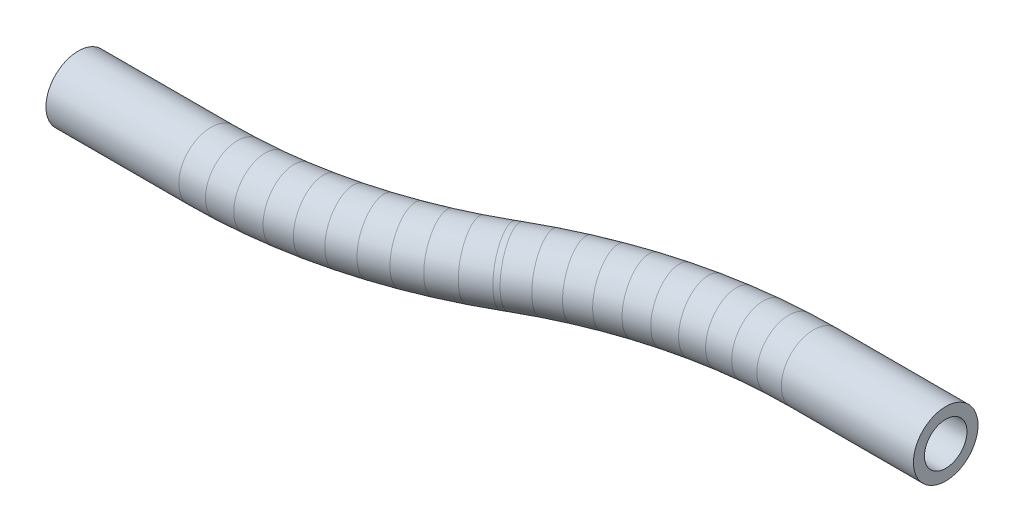
ISO-10303-21;
HEADER;
FILE_DESCRIPTION(('STEP AP214'),'2;1');
FILE_NAME('part.step','',(''),(''),'','','');
FILE_SCHEMA(('AUTOMOTIVE_DESIGN { 1 0 10303 214 1 1 1 1 }'));
ENDSEC;
DATA;
#1=APPLICATION_CONTEXT('core data for automotive mechanical design processes');
#2=APPLICATION_PROTOCOL_DEFINITION('international standard','automotive_design',2000,#1);
#3=PRODUCT_CONTEXT('',#1,'mechanical');
#4=PRODUCT('Part','Part','',(#3));
#5=PRODUCT_RELATED_PRODUCT_CATEGORY('part','',(#4));
#6=PRODUCT_DEFINITION_FORMATION('','',#4);
#7=PRODUCT_DEFINITION_CONTEXT('part definition',#1,'design');
#8=PRODUCT_DEFINITION('design','',#6,#7);
#9=PRODUCT_DEFINITION_SHAPE('','',#8);
#10=(LENGTH_UNIT() NAMED_UNIT(*) SI_UNIT(.MILLI.,.METRE.));
#11=(NAMED_UNIT(*) PLANE_ANGLE_UNIT() SI_UNIT($,.RADIAN.));
#12=(NAMED_UNIT(*) SI_UNIT($,.STERADIAN.) SOLID_ANGLE_UNIT());
#13=UNCERTAINTY_MEASURE_WITH_UNIT(LENGTH_MEASURE(1.E-05),#10,'distance_accuracy_value','');
#14=(GEOMETRIC_REPRESENTATION_CONTEXT(3) GLOBAL_UNCERTAINTY_ASSIGNED_CONTEXT((#13)) GLOBAL_UNIT_ASSIGNED_CONTEXT((#10,
#11,#12)) REPRESENTATION_CONTEXT('',''));
#15=CARTESIAN_POINT('',(0.,0.,0.));
#16=DIRECTION('',(0.,0.,1.));
#17=DIRECTION('',(1.,0.,0.));
#18=AXIS2_PLACEMENT_3D('',#15,#16,#17);
#19=CARTESIAN_POINT('',(-24.8125997034705,105.245573528022,38.3062560524749));
#20=DIRECTION('',(1.,0.,0.));
#21=DIRECTION('',(0.,0.,-1.));
#22=AXIS2_PLACEMENT_3D('',#19,#20,#21);
#23=CYLINDRICAL_SURFACE('',#22,6.);
#24=CARTESIAN_POINT('',(-24.6125997034709,105.245573528022,38.3062560524748));
#25=DIRECTION('',(0.99993495288336,0.00117156817280589,-0.0113453704288943));
#26=DIRECTION('',(-0.0114057004235759,0.102711093766131,-0.994645837077305));
#27=AXIS2_PLACEMENT_3D('',#24,#25,#26);
#28=ELLIPSE('',#27,6.00039030808825,6.);
#29=CARTESIAN_POINT('',(-24.6810383577494,105.861880179589,32.3379928116958));
#30=VERTEX_POINT('',#29);
#31=EDGE_CURVE('E45',#30,#30,#28,.F.);
#32=ORIENTED_EDGE('',*,*,#31,.F.);
#33=EDGE_LOOP('',(#32));
#34=FACE_BOUND('',#33,.T.);
#35=CARTESIAN_POINT('',(3.05311331771918E-13,105.245573528022,38.3062560524749));
#36=DIRECTION('',(1.,0.,0.));
#37=DIRECTION('',(0.,0.,-1.));
#38=AXIS2_PLACEMENT_3D('',#35,#36,#37);
#39=CIRCLE('',#38,6.);
#40=CARTESIAN_POINT('',(3.05311331771918E-13,105.245573528022,32.3062560524749));
#41=VERTEX_POINT('',#40);
#42=EDGE_CURVE('E124',#41,#41,#39,.T.);
#43=ORIENTED_EDGE('',*,*,#42,.F.);
#44=EDGE_LOOP('',(#43));
#45=FACE_BOUND('',#44,.T.);
#46=ADVANCED_FACE('F39',(#34,#45),#23,.T.);
#47=CARTESIAN_POINT('',(-29.5452626204273,105.234013370347,38.4182036745461));
#48=DIRECTION('',(0.999739819995695,0.00234298393134861,-0.0226892648905213));
#49=DIRECTION('',(-0.0226893271679736,0.,-0.999742564079706));
#50=AXIS2_PLACEMENT_3D('',#47,#48,#49);
#51=CYLINDRICAL_SURFACE('',#50,6.);
#52=CARTESIAN_POINT('',(-29.2646121022564,105.23467110113,38.4118342634042));
#53=DIRECTION('',(0.99895941537005,0.00468474866756274,-0.0453667231949676));
#54=DIRECTION('',(-0.0456079646939769,0.102610888723268,-0.993675459630505));
#55=AXIS2_PLACEMENT_3D('',#52,#53,#54);
#56=ELLIPSE('',#55,6.00156148629334,6.);
#57=CARTESIAN_POINT('',(-29.538331106632,105.850496658966,32.448229895011));
#58=VERTEX_POINT('',#57);
#59=EDGE_CURVE('E184',#58,#58,#56,.F.);
#60=ORIENTED_EDGE('',*,*,#59,.F.);
#61=EDGE_LOOP('',(#60));
#62=FACE_BOUND('',#61,.T.);
#63=ORIENTED_EDGE('',*,*,#31,.T.);
#64=EDGE_LOOP('',(#63));
#65=FACE_BOUND('',#64,.T.);
#66=ADVANCED_FACE('F192',(#62,#65),#51,.T.);
#67=CARTESIAN_POINT('',(-34.1870093127805,105.200014686749,38.7474441476682));
#68=DIRECTION('',(0.997659192214423,0.00702407564791989,-0.0680205744709416));
#69=DIRECTION('',(-0.0680222525202991,0.,-0.997683804199539));
#70=AXIS2_PLACEMENT_3D('',#67,#68,#69);
#71=CYLINDRICAL_SURFACE('',#70,6.);
#72=CARTESIAN_POINT('',(-33.9069428758409,105.201986510249,38.7283491700654));
#73=DIRECTION('',(0.995839827112946,0.00935974758020916,-0.0906390305601972));
#74=DIRECTION('',(-0.0911210114938239,0.10229045155763,-0.990572372310312));
#75=AXIS2_PLACEMENT_3D('',#72,#73,#74);
#76=ELLIPSE('',#75,6.00156148629334,6.);
#77=CARTESIAN_POINT('',(-34.4538112290143,105.815888944732,32.7833681710216));
#78=VERTEX_POINT('',#77);
#79=EDGE_CURVE('E185',#78,#78,#76,.F.);
#80=ORIENTED_EDGE('',*,*,#79,.F.);
#81=EDGE_LOOP('',(#80));
#82=FACE_BOUND('',#81,.T.);
#83=ORIENTED_EDGE('',*,*,#59,.T.);
#84=EDGE_LOOP('',(#83));
#85=FACE_BOUND('',#84,.T.);
#86=ADVANCED_FACE('F629',(#82,#85),#71,.T.);
#87=CARTESIAN_POINT('',(-38.8088300381733,105.144305965027,39.2869228555477));
#88=DIRECTION('',(0.993502266790459,0.011690549074167,-0.11321032172273));
#89=DIRECTION('',(-0.113218058682991,0.,-0.993570164199819));
#90=AXIS2_PLACEMENT_3D('',#87,#88,#89);
#91=CYLINDRICAL_SURFACE('',#90,6.);
#92=CARTESIAN_POINT('',(-38.5299305481241,105.147587777544,39.2551420513641));
#93=DIRECTION('',(0.990647727619871,0.0140152672739085,-0.135722702761279));
#94=DIRECTION('',(-0.13644442004562,0.101757130648779,-0.985407736219146));
#95=AXIS2_PLACEMENT_3D('',#92,#93,#94);
#96=ELLIPSE('',#95,6.00156148629334,6.);
#97=CARTESIAN_POINT('',(-39.3488101244895,105.758289453802,33.3411569333758));
#98=VERTEX_POINT('',#97);
#99=EDGE_CURVE('E176',#98,#98,#96,.F.);
#100=ORIENTED_EDGE('',*,*,#99,.F.);
#101=EDGE_LOOP('',(#100));
#102=FACE_BOUND('',#101,.T.);
#103=ORIENTED_EDGE('',*,*,#79,.T.);
#104=EDGE_LOOP('',(#103));
#105=FACE_BOUND('',#104,.T.);
#106=ADVANCED_FACE('F616',(#102,#105),#91,.T.);
#107=CARTESIAN_POINT('',(-43.4011060053869,105.067003144459,40.0355170516811));
#108=DIRECTION('',(0.98727769498921,0.0163326924890507,-0.158164459133051));
#109=DIRECTION('',(-0.158185559080532,0.,-0.987409402881287));
#110=AXIS2_PLACEMENT_3D('',#107,#108,#109);
#111=CYLINDRICAL_SURFACE('',#110,6.);
#112=CARTESIAN_POINT('',(-43.1239538992735,105.071588115987,39.9911165621497));
#113=DIRECTION('',(0.983393922528685,0.0186416188241878,-0.180523913045503));
#114=DIRECTION('',(-0.181483864664732,0.101012035927608,-0.978192299838898));
#115=AXIS2_PLACEMENT_3D('',#112,#113,#114);
#116=ELLIPSE('',#115,6.00156148629334,6.);
#117=CARTESIAN_POINT('',(-44.2131404718291,105.677818060463,34.1204353292478));
#118=VERTEX_POINT('',#117);
#119=EDGE_CURVE('E177',#118,#118,#116,.F.);
#120=ORIENTED_EDGE('',*,*,#119,.F.);
#121=EDGE_LOOP('',(#120));
#122=FACE_BOUND('',#121,.T.);
#123=ORIENTED_EDGE('',*,*,#99,.T.);
#124=EDGE_LOOP('',(#123));
#125=FACE_BOUND('',#124,.T.);
#126=ADVANCED_FACE('F608',(#122,#125),#111,.T.);
#127=CARTESIAN_POINT('',(-47.9542799108457,104.9682671053,40.9916687848395));
#128=DIRECTION('',(0.978998431198167,0.020940844806393,-0.202789429533009));
#129=DIRECTION('',(-0.202833907668942,0.,-0.97921315651892));
#130=AXIS2_PLACEMENT_3D('',#127,#128,#129);
#131=CYLINDRICAL_SURFACE('',#130,6.);
#132=CARTESIAN_POINT('',(-47.6794519891116,104.974145693737,40.9347410148941));
#133=DIRECTION('',(0.974093508235561,0.0232291740104186,-0.22494942251122));
#134=DIRECTION('',(-0.226145610643536,0.100056718062573,-0.968941079713937));
#135=AXIS2_PLACEMENT_3D('',#132,#133,#134);
#136=ELLIPSE('',#135,6.00156148629334,6.);
#137=CARTESIAN_POINT('',(-49.0366787762441,105.574642239307,35.1195815483954));
#138=VERTEX_POINT('',#137);
#139=EDGE_CURVE('E174',#138,#138,#136,.F.);
#140=ORIENTED_EDGE('',*,*,#139,.F.);
#141=EDGE_LOOP('',(#140));
#142=FACE_BOUND('',#141,.T.);
#143=ORIENTED_EDGE('',*,*,#119,.T.);
#144=EDGE_LOOP('',(#143));
#145=FACE_BOUND('',#144,.T.);
#146=ADVANCED_FACE('F601',(#142,#145),#131,.T.);
#147=CARTESIAN_POINT('',(-52.4588758289824,104.848303333959,42.1533881414279));
#148=DIRECTION('',(0.968681705966623,0.0255054156812561,-0.246992360805997));
#149=DIRECTION('',(-0.24707273752804,0.,-0.968996936202793));
#150=AXIS2_PLACEMENT_3D('',#147,#148,#149);
#151=CYLINDRICAL_SURFACE('',#150,6.);
#152=CARTESIAN_POINT('',(-52.1869440550501,104.855463304967,42.0840515673934));
#153=DIRECTION('',(0.962765840476829,0.027768385353765,-0.268906774153777));
#154=DIRECTION('',(-0.27033670932921,0.0988931652312726,-0.95767332919926));
#155=AXIS2_PLACEMENT_3D('',#152,#153,#154);
#156=ELLIPSE('',#155,6.00156148629334,6.);
#157=CARTESIAN_POINT('',(-53.8093864380916,105.448976716677,36.3365161984208));
#158=VERTEX_POINT('',#157);
#159=EDGE_CURVE('E168',#158,#158,#156,.F.);
#160=ORIENTED_EDGE('',*,*,#159,.F.);
#161=EDGE_LOOP('',(#160));
#162=FACE_BOUND('',#161,.T.);
#163=ORIENTED_EDGE('',*,*,#139,.T.);
#164=EDGE_LOOP('',(#163));
#165=FACE_BOUND('',#164,.T.);
#166=ADVANCED_FACE('F595',(#162,#165),#151,.T.);
#167=CARTESIAN_POINT('',(-56.9055189332441,104.707361495349,43.5182573868329));
#168=DIRECTION('',(0.956348990145995,0.0300169054690321,-0.290681259170244));
#169=DIRECTION('',(-0.290812301761619,0.,-0.95678012371919));
#170=AXIS2_PLACEMENT_3D('',#167,#168,#169);
#171=CYLINDRICAL_SURFACE('',#170,6.);
#172=CARTESIAN_POINT('',(-56.6370492431623,104.715787947817,43.4366563098556));
#173=DIRECTION('',(0.949434494046417,0.032249805987114,-0.312304485284182));
#174=DIRECTION('',(-0.313965191565601,0.0975237989848647,-0.944412498390791));
#175=AXIS2_PLACEMENT_3D('',#172,#173,#174);
#176=ELLIPSE('',#175,6.00156148629334,6.);
#177=CARTESIAN_POINT('',(-58.5213306448991,105.301083023802,37.7687066323394));
#178=VERTEX_POINT('',#177);
#179=EDGE_CURVE('E170',#178,#178,#176,.F.);
#180=ORIENTED_EDGE('',*,*,#179,.F.);
#181=EDGE_LOOP('',(#180));
#182=FACE_BOUND('',#181,.T.);
#183=ORIENTED_EDGE('',*,*,#159,.T.);
#184=EDGE_LOOP('',(#183));
#185=FACE_BOUND('',#184,.T.);
#186=ADVANCED_FACE('F581',(#182,#185),#171,.T.);
#187=CARTESIAN_POINT('',(-61.2849550066924,104.545734913292,45.083435997137));
#188=DIRECTION('',(0.942025950205343,0.034465924995875,-0.333765200633468));
#189=DIRECTION('',(-0.333963617263862,0.,-0.942585965492823));
#190=AXIS2_PLACEMENT_3D('',#187,#188,#189);
#191=CYLINDRICAL_SURFACE('',#190,6.);
#192=CARTESIAN_POINT('',(-61.0205061313273,104.555410310346,44.98974024287));
#193=DIRECTION('',(0.934127213732707,0.0366641093156083,-0.355052237920088));
#194=DIRECTION('',(-0.35694025909663,0.0959514692057042,-0.929186185322025));
#195=AXIS2_PLACEMENT_3D('',#192,#193,#194);
#196=ELLIPSE('',#195,6.00156148629334,6.);
#197=CARTESIAN_POINT('',(-63.1627050432292,105.131268952485,39.4131722194455));
#198=VERTEX_POINT('',#197);
#199=EDGE_CURVE('E163',#198,#198,#196,.F.);
#200=ORIENTED_EDGE('',*,*,#199,.F.);
#201=EDGE_LOOP('',(#200));
#202=FACE_BOUND('',#201,.T.);
#203=ORIENTED_EDGE('',*,*,#179,.T.);
#204=EDGE_LOOP('',(#203));
#205=FACE_BOUND('',#204,.T.);
#206=ADVANCED_FACE('F571',(#202,#205),#191,.T.);
#207=CARTESIAN_POINT('',(-65.5880697015955,104.363759960063,46.8456665707303));
#208=DIRECTION('',(0.925742394815091,0.0388432150991025,-0.376154520221126));
#209=DIRECTION('',(-0.376438611835892,0.,-0.926441564006638));
#210=AXIS2_PLACEMENT_3D('',#207,#208,#209);
#211=CYLINDRICAL_SURFACE('',#210,6.);
#212=CARTESIAN_POINT('',(-65.3281920038173,104.374664165564,46.7400711358973));
#213=DIRECTION('',(0.91687585657694,0.0410021084268519,-0.39706106675278));
#214=DIRECTION('',(-0.399172473532812,0.0941794481783722,-0.912026078527645));
#215=AXIS2_PLACEMENT_3D('',#212,#213,#214);
#216=ELLIPSE('',#215,6.00156148629334,6.);
#217=CARTESIAN_POINT('',(-67.7238501473603,104.939887914552,41.2664905485106));
#218=VERTEX_POINT('',#217);
#219=EDGE_CURVE('E161',#218,#218,#216,.F.);
#220=ORIENTED_EDGE('',*,*,#219,.F.);
#221=EDGE_LOOP('',(#220));
#222=FACE_BOUND('',#221,.T.);
#223=ORIENTED_EDGE('',*,*,#199,.T.);
#224=EDGE_LOOP('',(#223));
#225=FACE_BOUND('',#224,.T.);
#226=ADVANCED_FACE('F563',(#222,#225),#211,.T.);
#227=CARTESIAN_POINT('',(-69.7326482797753,104.165297743611,48.7675584538048));
#228=DIRECTION('',(0.907532212810167,0.0431396658971071,-0.41776099858432));
#229=DIRECTION('',(-0.418150275047483,0.,-0.908377866021467));
#230=AXIS2_PLACEMENT_3D('',#227,#228,#229);
#231=CYLINDRICAL_SURFACE('',#230,6.);
#232=CARTESIAN_POINT('',(-69.5511418372134,104.17392567679,48.6840062540879));
#233=DIRECTION('',(0.902682986117241,0.0442000956425537,-0.428030113566383));
#234=DIRECTION('',(-0.430306200948187,0.0927215881004454,-0.897908280686658));
#235=AXIS2_PLACEMENT_3D('',#232,#233,#234);
#236=ELLIPSE('',#235,6.00039030808825,6.);
#237=CARTESIAN_POINT('',(-72.1331469948932,104.730291395379,43.2962061091035));
#238=VERTEX_POINT('',#237);
#239=EDGE_CURVE('E158',#238,#238,#236,.F.);
#240=ORIENTED_EDGE('',*,*,#239,.F.);
#241=EDGE_LOOP('',(#240));
#242=FACE_BOUND('',#241,.T.);
#243=ORIENTED_EDGE('',*,*,#219,.T.);
#244=EDGE_LOOP('',(#243));
#245=FACE_BOUND('',#244,.T.);
#246=ADVANCED_FACE('F557',(#242,#245),#231,.T.);
#247=CARTESIAN_POINT('',(-70.6284014279014,104.119619946538,49.2098985072467));
#248=DIRECTION('',(0.897716325573341,0.0452547752104468,-0.438243544299001));
#249=DIRECTION('',(-0.438692994994909,0.,-0.898636999094961));
#250=AXIS2_PLACEMENT_3D('',#247,#248,#249);
#251=CYLINDRICAL_SURFACE('',#250,6.);
#252=CARTESIAN_POINT('',(-70.4488581627867,104.12867090158,49.1222497983869));
#253=DIRECTION('',(0.902682986117241,0.0442000956425536,-0.428030113566382));
#254=DIRECTION('',(0.430306200948187,-0.0927215881004451,0.897908280686658));
#255=AXIS2_PLACEMENT_3D('',#252,#253,#254);
#256=ELLIPSE('',#255,6.00039030808825,6.);
#257=CARTESIAN_POINT('',(-67.8668530051069,103.572305182991,54.5100499433713));
#258=VERTEX_POINT('',#257);
#259=EDGE_CURVE('E154',#258,#258,#256,.F.);
#260=ORIENTED_EDGE('',*,*,#259,.F.);
#261=EDGE_LOOP('',(#260));
#262=FACE_BOUND('',#261,.T.);
#263=ORIENTED_EDGE('',*,*,#239,.T.);
#264=EDGE_LOOP('',(#263));
#265=FACE_BOUND('',#264,.T.);
#266=ADVANCED_FACE('F550',(#262,#265),#251,.T.);
#267=CARTESIAN_POINT('',(-74.9265736668979,103.915822092355,51.1834602700038));
#268=DIRECTION('',(0.907532212810167,0.043139665897107,-0.417760998584319));
#269=DIRECTION('',(-0.418150275047482,0.,-0.908377866021468));
#270=AXIS2_PLACEMENT_3D('',#267,#268,#269);
#271=CYLINDRICAL_SURFACE('',#270,6.);
#272=CARTESIAN_POINT('',(-74.6718079961827,103.927932412806,51.0661849165776));
#273=DIRECTION('',(0.916875856576941,0.0410021084268518,-0.397061066752777));
#274=DIRECTION('',(0.399172473532809,-0.0941794481783617,0.912026078527647));
#275=AXIS2_PLACEMENT_3D('',#272,#273,#274);
#276=ELLIPSE('',#275,6.00156148629334,6.);
#277=CARTESIAN_POINT('',(-72.2761498526397,103.362708663819,56.5397655039643));
#278=VERTEX_POINT('',#277);
#279=EDGE_CURVE('E155',#278,#278,#276,.F.);
#280=ORIENTED_EDGE('',*,*,#279,.F.);
#281=EDGE_LOOP('',(#280));
#282=FACE_BOUND('',#281,.T.);
#283=ORIENTED_EDGE('',*,*,#259,.T.);
#284=EDGE_LOOP('',(#283));
#285=FACE_BOUND('',#284,.T.);
#286=ADVANCED_FACE('F538',(#282,#285),#271,.T.);
#287=CARTESIAN_POINT('',(-79.2393715664508,103.736282062523,52.9221112444378));
#288=DIRECTION('',(0.925742394815092,0.0388432150991027,-0.376154520221122));
#289=DIRECTION('',(-0.376438611835887,0.,-0.92644156400664));
#290=AXIS2_PLACEMENT_3D('',#287,#288,#289);
#291=CYLINDRICAL_SURFACE('',#290,6.);
#292=CARTESIAN_POINT('',(-78.9794938686727,103.747186268024,52.8165158096047));
#293=DIRECTION('',(0.934127213732707,0.0366641093156084,-0.355052237920088));
#294=DIRECTION('',(0.356940259096631,-0.0959514692057319,0.929186185322022));
#295=AXIS2_PLACEMENT_3D('',#292,#293,#294);
#296=ELLIPSE('',#295,6.00156148629334,6.);
#297=CARTESIAN_POINT('',(-76.8372949567708,103.171327625885,58.3930838330292));
#298=VERTEX_POINT('',#297);
#299=EDGE_CURVE('E149',#298,#298,#296,.F.);
#300=ORIENTED_EDGE('',*,*,#299,.F.);
#301=EDGE_LOOP('',(#300));
#302=FACE_BOUND('',#301,.T.);
#303=ORIENTED_EDGE('',*,*,#279,.T.);
#304=EDGE_LOOP('',(#303));
#305=FACE_BOUND('',#304,.T.);
#306=ADVANCED_FACE('F530',(#302,#305),#291,.T.);
#307=CARTESIAN_POINT('',(-83.6273996322027,103.577133233499,54.4632954968861));
#308=DIRECTION('',(0.942025950205341,0.034465924995875,-0.333765200633474));
#309=DIRECTION('',(-0.333963617263868,0.,-0.942585965492821));
#310=AXIS2_PLACEMENT_3D('',#307,#308,#309);
#311=CYLINDRICAL_SURFACE('',#310,6.);
#312=CARTESIAN_POINT('',(-83.3629507568377,103.586808630553,54.3695997426192));
#313=DIRECTION('',(0.949434494046416,0.0322498059871141,-0.312304485284185));
#314=DIRECTION('',(0.313965191565603,-0.0975237989848511,0.944412498390791));
#315=AXIS2_PLACEMENT_3D('',#312,#313,#314);
#316=ELLIPSE('',#315,6.00156148629334,6.);
#317=CARTESIAN_POINT('',(-81.4786693551008,103.001513554568,60.0375494201354));
#318=VERTEX_POINT('',#317);
#319=EDGE_CURVE('E148',#318,#318,#316,.F.);
#320=ORIENTED_EDGE('',*,*,#319,.F.);
#321=EDGE_LOOP('',(#320));
#322=FACE_BOUND('',#321,.T.);
#323=ORIENTED_EDGE('',*,*,#299,.T.);
#324=EDGE_LOOP('',(#323));
#325=FACE_BOUND('',#324,.T.);
#326=ADVANCED_FACE('F518',(#322,#325),#311,.T.);
#327=CARTESIAN_POINT('',(-88.0815256350316,103.438706820935,55.8038055620587));
#328=DIRECTION('',(0.956348990145995,0.030016905469032,-0.290681259170244));
#329=DIRECTION('',(-0.290812301761618,0.,-0.956780123719191));
#330=AXIS2_PLACEMENT_3D('',#327,#328,#329);
#331=CYLINDRICAL_SURFACE('',#330,6.);
#332=CARTESIAN_POINT('',(-87.8130559449499,103.447133273403,55.7222044850815));
#333=DIRECTION('',(0.962765840476829,0.027768385353765,-0.268906774153777));
#334=DIRECTION('',(0.27033670932921,-0.0988931652312741,0.95767332919926));
#335=AXIS2_PLACEMENT_3D('',#332,#333,#334);
#336=ELLIPSE('',#335,6.00156148629334,6.);
#337=CARTESIAN_POINT('',(-86.1906135619084,102.853619861693,61.4697398540541));
#338=VERTEX_POINT('',#337);
#339=EDGE_CURVE('E141',#338,#338,#336,.F.);
#340=ORIENTED_EDGE('',*,*,#339,.F.);
#341=EDGE_LOOP('',(#340));
#342=FACE_BOUND('',#341,.T.);
#343=ORIENTED_EDGE('',*,*,#319,.T.);
#344=EDGE_LOOP('',(#343));
#345=FACE_BOUND('',#344,.T.);
#346=ADVANCED_FACE('F512',(#342,#345),#331,.T.);
#347=CARTESIAN_POINT('',(-92.5924797848207,103.321290913625,56.9408516116154));
#348=DIRECTION('',(0.968681705966623,0.0255054156812562,-0.246992360805997));
#349=DIRECTION('',(-0.247072737528041,0.,-0.968996936202793));
#350=AXIS2_PLACEMENT_3D('',#347,#348,#349);
#351=CYLINDRICAL_SURFACE('',#350,6.);
#352=CARTESIAN_POINT('',(-92.3205480108884,103.328450884633,56.8715150375808));
#353=DIRECTION('',(0.974093508235561,0.0232291740104202,-0.224949422511221));
#354=DIRECTION('',(0.226145610643537,-0.100056718062509,0.968941079713943));
#355=AXIS2_PLACEMENT_3D('',#352,#353,#354);
#356=ELLIPSE('',#355,6.00156148629334,6.);
#357=CARTESIAN_POINT('',(-90.9633212237559,102.727954339064,62.6866745040795));
#358=VERTEX_POINT('',#357);
#359=EDGE_CURVE('E138',#358,#358,#356,.F.);
#360=ORIENTED_EDGE('',*,*,#359,.F.);
#361=EDGE_LOOP('',(#360));
#362=FACE_BOUND('',#361,.T.);
#363=ORIENTED_EDGE('',*,*,#339,.T.);
#364=EDGE_LOOP('',(#363));
#365=FACE_BOUND('',#364,.T.);
#366=ADVANCED_FACE('F505',(#362,#365),#351,.T.);
#367=CARTESIAN_POINT('',(-97.1508740224605,103.225129873946,57.8720672602706));
#368=DIRECTION('',(0.978998431198166,0.0209408448063961,-0.202789429533009));
#369=DIRECTION('',(-0.202833907668943,0.,-0.97921315651892));
#370=AXIS2_PLACEMENT_3D('',#367,#368,#369);
#371=CYLINDRICAL_SURFACE('',#370,6.);
#372=CARTESIAN_POINT('',(-96.8760461007265,103.231008462383,57.8151394903252));
#373=DIRECTION('',(0.983393922528686,0.0186416188241878,-0.180523913045501));
#374=DIRECTION('',(0.18148386466473,-0.101012035927732,0.978192299838886));
#375=AXIS2_PLACEMENT_3D('',#372,#373,#374);
#376=ELLIPSE('',#375,6.00156148629334,6.);
#377=CARTESIAN_POINT('',(-95.7868595281709,102.624778517907,63.6858207232269));
#378=VERTEX_POINT('',#377);
#379=EDGE_CURVE('E139',#378,#378,#376,.F.);
#380=ORIENTED_EDGE('',*,*,#379,.F.);
#381=EDGE_LOOP('',(#380));
#382=FACE_BOUND('',#381,.T.);
#383=ORIENTED_EDGE('',*,*,#359,.T.);
#384=EDGE_LOOP('',(#383));
#385=FACE_BOUND('',#384,.T.);
#386=ADVANCED_FACE('F492',(#382,#385),#371,.T.);
#387=CARTESIAN_POINT('',(-101.747221557989,103.150423829298,58.5955144906421));
#388=DIRECTION('',(0.987277694989211,0.0163326924890476,-0.158164459133047));
#389=DIRECTION('',(-0.158185559080528,0.,-0.987409402881288));
#390=AXIS2_PLACEMENT_3D('',#387,#388,#389);
#391=CYLINDRICAL_SURFACE('',#390,6.);
#392=CARTESIAN_POINT('',(-101.470069451876,103.155008800826,58.5511140011107));
#393=DIRECTION('',(0.990647727619871,0.014015267273907,-0.135722702761279));
#394=DIRECTION('',(0.136444420045619,-0.101757130648728,0.985407736219151));
#395=AXIS2_PLACEMENT_3D('',#392,#393,#394);
#396=ELLIPSE('',#395,6.00156148629334,6.);
#397=CARTESIAN_POINT('',(-100.651189875511,102.544307124569,64.4650991190991));
#398=VERTEX_POINT('',#397);
#399=EDGE_CURVE('E131',#398,#398,#396,.F.);
#400=ORIENTED_EDGE('',*,*,#399,.F.);
#401=EDGE_LOOP('',(#400));
#402=FACE_BOUND('',#401,.T.);
#403=ORIENTED_EDGE('',*,*,#379,.T.);
#404=EDGE_LOOP('',(#403));
#405=FACE_BOUND('',#404,.T.);
#406=ADVANCED_FACE('F482',(#402,#405),#391,.T.);
#407=CARTESIAN_POINT('',(-106.371956614208,103.097328255604,59.109687686593));
#408=DIRECTION('',(0.993502266790459,0.011690549074167,-0.113210321722733));
#409=DIRECTION('',(-0.113218058682995,0.,-0.993570164199818));
#410=AXIS2_PLACEMENT_3D('',#407,#408,#409);
#411=CYLINDRICAL_SURFACE('',#410,6.);
#412=CARTESIAN_POINT('',(-106.093057124159,103.100610068122,59.0779068824095));
#413=DIRECTION('',(0.995839827112946,0.00935974758020917,-0.0906390305602017));
#414=DIRECTION('',(0.0911210114938285,-0.102290451557637,0.990572372310311));
#415=AXIS2_PLACEMENT_3D('',#412,#413,#414);
#416=ELLIPSE('',#415,6.00156148629334,6.);
#417=CARTESIAN_POINT('',(-105.546188770986,102.486707633638,65.0228878814533));
#418=VERTEX_POINT('',#417);
#419=EDGE_CURVE('E132',#418,#418,#416,.F.);
#420=ORIENTED_EDGE('',*,*,#419,.F.);
#421=EDGE_LOOP('',(#420));
#422=FACE_BOUND('',#421,.T.);
#423=ORIENTED_EDGE('',*,*,#399,.T.);
#424=EDGE_LOOP('',(#423));
#425=FACE_BOUND('',#424,.T.);
#426=ADVANCED_FACE('F474',(#422,#425),#411,.T.);
#427=CARTESIAN_POINT('',(-111.015454334683,103.065953653741,59.4135167666735));
#428=DIRECTION('',(0.997659192214423,0.00702407564791989,-0.0680205744709476));
#429=DIRECTION('',(-0.068022252520305,0.,-0.997683804199539));
#430=AXIS2_PLACEMENT_3D('',#427,#428,#429);
#431=CYLINDRICAL_SURFACE('',#430,6.);
#432=CARTESIAN_POINT('',(-110.735387897744,103.06792547724,59.3944217890706));
#433=DIRECTION('',(0.998959415370051,0.00468474866756275,-0.0453667231949676));
#434=DIRECTION('',(0.0456079646939769,-0.102610888723241,0.993675459630507));
#435=AXIS2_PLACEMENT_3D('',#432,#433,#434);
#436=ELLIPSE('',#435,6.00156148629334,6.);
#437=CARTESIAN_POINT('',(-110.461668893368,102.452099919405,65.3580261574639));
#438=VERTEX_POINT('',#437);
#439=EDGE_CURVE('E126',#438,#438,#436,.F.);
#440=ORIENTED_EDGE('',*,*,#439,.F.);
#441=EDGE_LOOP('',(#440));
#442=FACE_BOUND('',#441,.T.);
#443=ORIENTED_EDGE('',*,*,#419,.T.);
#444=EDGE_LOOP('',(#443));
#445=FACE_BOUND('',#444,.T.);
#446=ADVANCED_FACE('F467',(#442,#445),#431,.T.);
#447=CARTESIAN_POINT('',(-115.587348260528,103.056554453562,59.5045378529781));
#448=DIRECTION('',(0.999739819995695,0.00234298393134861,-0.0226892648905153));
#449=DIRECTION('',(-0.0226893271679676,0.,-0.999742564079706));
#450=AXIS2_PLACEMENT_3D('',#447,#448,#449);
#451=CYLINDRICAL_SURFACE('',#450,6.);
#452=CARTESIAN_POINT('',(-115.387400296529,103.057023050348,59.5));
#453=DIRECTION('',(0.99993495288336,0.00117156817280589,-0.0113453704288913));
#454=DIRECTION('',(0.0114057004235729,-0.102711093766158,0.994645837077302));
#455=AXIS2_PLACEMENT_3D('',#452,#453,#454);
#456=ELLIPSE('',#455,6.00039030808825,6.);
#457=CARTESIAN_POINT('',(-115.318961642251,102.440716398781,65.468263240779));
#458=VERTEX_POINT('',#457);
#459=EDGE_CURVE('E123',#458,#458,#456,.F.);
#460=ORIENTED_EDGE('',*,*,#459,.F.);
#461=EDGE_LOOP('',(#460));
#462=FACE_BOUND('',#461,.T.);
#463=ORIENTED_EDGE('',*,*,#439,.T.);
#464=EDGE_LOOP('',(#463));
#465=FACE_BOUND('',#464,.T.);
#466=ADVANCED_FACE('F209',(#462,#465),#451,.T.);
#467=CARTESIAN_POINT('',(-140.,103.057023050348,59.5));
#468=DIRECTION('',(1.,0.,0.));
#469=DIRECTION('',(0.,0.,-1.));
#470=AXIS2_PLACEMENT_3D('',#467,#468,#469);
#471=CYLINDRICAL_SURFACE('',#470,6.);
#472=CARTESIAN_POINT('',(-140.,103.057023050348,59.5));
#473=DIRECTION('',(1.,0.,0.));
#474=DIRECTION('',(0.,0.,-1.));
#475=AXIS2_PLACEMENT_3D('',#472,#473,#474);
#476=CIRCLE('',#475,6.);
#477=CARTESIAN_POINT('',(-140.,103.057023050348,53.5));
#478=VERTEX_POINT('',#477);
#479=EDGE_CURVE('E116',#478,#478,#476,.T.);
#480=ORIENTED_EDGE('',*,*,#479,.T.);
#481=EDGE_LOOP('',(#480));
#482=FACE_BOUND('',#481,.T.);
#483=ORIENTED_EDGE('',*,*,#459,.T.);
#484=EDGE_LOOP('',(#483));
#485=FACE_BOUND('',#484,.T.);
#486=ADVANCED_FACE('F199',(#482,#485),#471,.T.);
#487=CARTESIAN_POINT('',(3.05311331771918E-13,105.245573528022,38.3062560524749));
#488=DIRECTION('',(1.,0.,0.));
#489=DIRECTION('',(0.,0.,-1.));
#490=AXIS2_PLACEMENT_3D('',#487,#488,#489);
#491=PLANE('',#490);
#492=CARTESIAN_POINT('',(3.05311331771918E-13,105.245573528022,38.3062560524749));
#493=DIRECTION('',(1.,0.,0.));
#494=DIRECTION('',(0.,0.,-1.));
#495=AXIS2_PLACEMENT_3D('',#492,#493,#494);
#496=CIRCLE('',#495,3.95);
#497=CARTESIAN_POINT('',(3.05311331771918E-13,105.245573528022,34.3562560524749));
#498=VERTEX_POINT('',#497);
#499=EDGE_CURVE('E117',#498,#498,#496,.F.);
#500=ORIENTED_EDGE('',*,*,#499,.T.);
#501=EDGE_LOOP('',(#500));
#502=FACE_BOUND('',#501,.T.);
#503=ORIENTED_EDGE('',*,*,#42,.T.);
#504=EDGE_LOOP('',(#503));
#505=FACE_BOUND('',#504,.T.);
#506=ADVANCED_FACE('F197',(#502,#505),#491,.T.);
#507=CARTESIAN_POINT('',(-140.,103.057023050348,59.5));
#508=DIRECTION('',(1.,0.,0.));
#509=DIRECTION('',(0.,0.,-1.));
#510=AXIS2_PLACEMENT_3D('',#507,#508,#509);
#511=PLANE('',#510);
#512=CARTESIAN_POINT('',(-140.,103.057023050348,59.5));
#513=DIRECTION('',(1.,0.,0.));
#514=DIRECTION('',(0.,0.,-1.));
#515=AXIS2_PLACEMENT_3D('',#512,#513,#514);
#516=CIRCLE('',#515,3.95);
#517=CARTESIAN_POINT('',(-140.,103.057023050348,55.55));
#518=VERTEX_POINT('',#517);
#519=EDGE_CURVE('E46',#518,#518,#516,.F.);
#520=ORIENTED_EDGE('',*,*,#519,.F.);
#521=EDGE_LOOP('',(#520));
#522=FACE_BOUND('',#521,.T.);
#523=ORIENTED_EDGE('',*,*,#479,.F.);
#524=EDGE_LOOP('',(#523));
#525=FACE_BOUND('',#524,.T.);
#526=ADVANCED_FACE('F200',(#522,#525),#511,.F.);
#527=CARTESIAN_POINT('',(-24.8125997034705,105.245573528022,38.3062560524749));
#528=DIRECTION('',(1.,0.,0.));
#529=DIRECTION('',(0.,0.,-1.));
#530=AXIS2_PLACEMENT_3D('',#527,#528,#529);
#531=CYLINDRICAL_SURFACE('',#530,3.95);
#532=CARTESIAN_POINT('',(-24.6125997034709,105.245573528022,38.3062560524748));
#533=DIRECTION('',(0.99993495288336,0.00117156817280589,-0.0113453704288943));
#534=DIRECTION('',(-0.0114057004235759,0.102711093766131,-0.994645837077305));
#535=AXIS2_PLACEMENT_3D('',#532,#533,#534);
#536=ELLIPSE('',#535,3.95025695282477,3.95);
#537=CARTESIAN_POINT('',(-24.6576551508709,105.651308740304,34.377149418962));
#538=VERTEX_POINT('',#537);
#539=EDGE_CURVE('E114',#538,#538,#536,.T.);
#540=ORIENTED_EDGE('',*,*,#539,.F.);
#541=EDGE_LOOP('',(#540));
#542=FACE_BOUND('',#541,.T.);
#543=ORIENTED_EDGE('',*,*,#499,.F.);
#544=EDGE_LOOP('',(#543));
#545=FACE_BOUND('',#544,.T.);
#546=ADVANCED_FACE('F210',(#542,#545),#531,.F.);
#547=CARTESIAN_POINT('',(-29.4835314705687,105.23415804308,38.4168026756231));
#548=DIRECTION('',(0.999739819995695,0.00234298393134861,-0.0226892648905213));
#549=DIRECTION('',(-0.0226893271679736,0.,-0.999742564079706));
#550=AXIS2_PLACEMENT_3D('',#547,#548,#549);
#551=CYLINDRICAL_SURFACE('',#550,3.95);
#552=CARTESIAN_POINT('',(-29.2646121022564,105.23467110113,38.4118342634042));
#553=DIRECTION('',(0.99895941537005,0.00468474866756274,-0.0453667231949676));
#554=DIRECTION('',(-0.0456079646939769,0.102610888723268,-0.993675459630504));
#555=AXIS2_PLACEMENT_3D('',#552,#553,#554);
#556=ELLIPSE('',#555,3.95102797847645,3.95);
#557=CARTESIAN_POINT('',(-29.4448104468036,105.640089593372,34.4857947208787));
#558=VERTEX_POINT('',#557);
#559=EDGE_CURVE('E109',#558,#558,#556,.T.);
#560=ORIENTED_EDGE('',*,*,#559,.F.);
#561=EDGE_LOOP('',(#560));
#562=FACE_BOUND('',#561,.T.);
#563=ORIENTED_EDGE('',*,*,#539,.T.);
#564=EDGE_LOOP('',(#563));
#565=FACE_BOUND('',#564,.T.);
#566=ADVANCED_FACE('F296',(#562,#565),#551,.F.);
#567=CARTESIAN_POINT('',(-34.1254066358934,105.20044840386,38.743244066615));
#568=DIRECTION('',(0.997659192214423,0.00702407564791989,-0.0680205744709416));
#569=DIRECTION('',(-0.0680222525202991,0.,-0.997683804199539));
#570=AXIS2_PLACEMENT_3D('',#567,#568,#569);
#571=CYLINDRICAL_SURFACE('',#570,3.95);
#572=CARTESIAN_POINT('',(-33.9069428758409,105.201986510249,38.7283491700654));
#573=DIRECTION('',(0.995839827112946,0.00935974758020915,-0.0906390305601971));
#574=DIRECTION('',(-0.0911210114938239,0.10229045155763,-0.990572372310312));
#575=AXIS2_PLACEMENT_3D('',#572,#573,#574);
#576=ELLIPSE('',#575,3.95102797847645,3.95);
#577=CARTESIAN_POINT('',(-34.26696454168,105.606138946284,34.8145700123615));
#578=VERTEX_POINT('',#577);
#579=EDGE_CURVE('E110',#578,#578,#576,.T.);
#580=ORIENTED_EDGE('',*,*,#579,.F.);
#581=EDGE_LOOP('',(#580));
#582=FACE_BOUND('',#581,.T.);
#583=ORIENTED_EDGE('',*,*,#559,.T.);
#584=EDGE_LOOP('',(#583));
#585=FACE_BOUND('',#584,.T.);
#586=ADVANCED_FACE('F293',(#582,#585),#571,.F.);
#587=CARTESIAN_POINT('',(-38.7474840398551,105.145027823877,39.2799324334438));
#588=DIRECTION('',(0.993502266790459,0.011690549074167,-0.11321032172273));
#589=DIRECTION('',(-0.113218058682991,0.,-0.993570164199819));
#590=AXIS2_PLACEMENT_3D('',#587,#588,#589);
#591=CYLINDRICAL_SURFACE('',#590,3.95);
#592=CARTESIAN_POINT('',(-38.5299305481241,105.147587777544,39.2551420513641));
#593=DIRECTION('',(0.990647727619871,0.0140152672739085,-0.135722702761279));
#594=DIRECTION('',(-0.13644442004562,0.101757130648779,-0.985407736219146));
#595=AXIS2_PLACEMENT_3D('',#592,#593,#594);
#596=ELLIPSE('',#595,3.95102797847645,3.95);
#597=CARTESIAN_POINT('',(-39.0690262692313,105.549633047747,35.3617685153551));
#598=VERTEX_POINT('',#597);
#599=EDGE_CURVE('E102',#598,#598,#596,.T.);
#600=ORIENTED_EDGE('',*,*,#599,.F.);
#601=EDGE_LOOP('',(#600));
#602=FACE_BOUND('',#601,.T.);
#603=ORIENTED_EDGE('',*,*,#579,.T.);
#604=EDGE_LOOP('',(#603));
#605=FACE_BOUND('',#604,.T.);
#606=ADVANCED_FACE('F292',(#602,#605),#591,.F.);
#607=CARTESIAN_POINT('',(-43.3401443570436,105.068011642738,40.0257508367783));
#608=DIRECTION('',(0.98727769498921,0.0163326924890507,-0.158164459133051));
#609=DIRECTION('',(-0.158185559080532,0.,-0.987409402881287));
#610=AXIS2_PLACEMENT_3D('',#607,#608,#609);
#611=CYLINDRICAL_SURFACE('',#610,3.95);
#612=CARTESIAN_POINT('',(-43.1239538992735,105.071588115987,39.9911165621497));
#613=DIRECTION('',(0.983393922528685,0.0186416188241878,-0.180523913045503));
#614=DIRECTION('',(-0.181483864664732,0.101012035927608,-0.978192299838898));
#615=AXIS2_PLACEMENT_3D('',#612,#613,#614);
#616=ELLIPSE('',#615,3.95102797847645,3.95);
#617=CARTESIAN_POINT('',(-43.8410017262059,105.4706894961,36.126251417156));
#618=VERTEX_POINT('',#617);
#619=EDGE_CURVE('E101',#618,#618,#616,.T.);
#620=ORIENTED_EDGE('',*,*,#619,.F.);
#621=EDGE_LOOP('',(#620));
#622=FACE_BOUND('',#621,.T.);
#623=ORIENTED_EDGE('',*,*,#599,.T.);
#624=EDGE_LOOP('',(#623));
#625=FACE_BOUND('',#624,.T.);
#626=ADVANCED_FACE('F289',(#622,#625),#611,.F.);
#627=CARTESIAN_POINT('',(-47.8938294839858,104.969560144152,40.9791471022838));
#628=DIRECTION('',(0.978998431198167,0.020940844806393,-0.202789429533009));
#629=DIRECTION('',(-0.202833907668942,0.,-0.97921315651892));
#630=AXIS2_PLACEMENT_3D('',#627,#628,#629);
#631=CYLINDRICAL_SURFACE('',#630,3.95);
#632=CARTESIAN_POINT('',(-47.6794519891116,104.974145693737,40.9347410148941));
#633=DIRECTION('',(0.974093508235561,0.0232291740104186,-0.22494942251122));
#634=DIRECTION('',(-0.226145610643536,0.100056718062573,-0.968941079713937));
#635=AXIS2_PLACEMENT_3D('',#632,#633,#634);
#636=ELLIPSE('',#635,3.95102797847645,3.95);
#637=CARTESIAN_POINT('',(-48.5729596239739,105.369472586237,37.1064276994491));
#638=VERTEX_POINT('',#637);
#639=EDGE_CURVE('E98',#638,#638,#636,.T.);
#640=ORIENTED_EDGE('',*,*,#639,.F.);
#641=EDGE_LOOP('',(#640));
#642=FACE_BOUND('',#641,.T.);
#643=ORIENTED_EDGE('',*,*,#619,.T.);
#644=EDGE_LOOP('',(#643));
#645=FACE_BOUND('',#644,.T.);
#646=ADVANCED_FACE('F284',(#642,#645),#631,.F.);
#647=CARTESIAN_POINT('',(-52.3990624311761,104.849878222351,42.1381370509603));
#648=DIRECTION('',(0.968681705966623,0.0255054156812561,-0.246992360805997));
#649=DIRECTION('',(-0.24707273752804,0.,-0.968996936202793));
#650=AXIS2_PLACEMENT_3D('',#647,#648,#649);
#651=CYLINDRICAL_SURFACE('',#650,3.95);
#652=CARTESIAN_POINT('',(-52.1869440550501,104.855463304967,42.0840515673934));
#653=DIRECTION('',(0.962765840476829,0.027768385353765,-0.268906774153777));
#654=DIRECTION('',(-0.27033670932921,0.0988931652312728,-0.95767332919926));
#655=AXIS2_PLACEMENT_3D('',#652,#653,#654);
#656=ELLIPSE('',#655,3.95102797847645,3.95);
#657=CARTESIAN_POINT('',(-53.2550519572191,105.246192967676,38.3002574494864));
#658=VERTEX_POINT('',#657);
#659=EDGE_CURVE('E92',#658,#658,#656,.T.);
#660=ORIENTED_EDGE('',*,*,#659,.F.);
#661=EDGE_LOOP('',(#660));
#662=FACE_BOUND('',#661,.T.);
#663=ORIENTED_EDGE('',*,*,#639,.T.);
#664=EDGE_LOOP('',(#663));
#665=FACE_BOUND('',#664,.T.);
#666=ADVANCED_FACE('F276',(#662,#665),#651,.F.);
#667=CARTESIAN_POINT('',(-56.8464670462961,104.709214955672,43.500308628554));
#668=DIRECTION('',(0.956348990145995,0.0300169054690321,-0.290681259170244));
#669=DIRECTION('',(-0.290812301761619,0.,-0.95678012371919));
#670=AXIS2_PLACEMENT_3D('',#667,#668,#669);
#671=CYLINDRICAL_SURFACE('',#670,3.95);
#672=CARTESIAN_POINT('',(-56.6370492431623,104.715787947817,43.4366563098556));
#673=DIRECTION('',(0.949434494046417,0.032249805987114,-0.312304485284182));
#674=DIRECTION('',(-0.313965191565601,0.0975237989848643,-0.944412498390791));
#675=AXIS2_PLACEMENT_3D('',#672,#673,#674);
#676=ELLIPSE('',#675,3.95102797847645,3.95);
#677=CARTESIAN_POINT('',(-57.8775344993057,105.101107206174,39.7052561054908));
#678=VERTEX_POINT('',#677);
#679=EDGE_CURVE('E95',#678,#678,#676,.T.);
#680=ORIENTED_EDGE('',*,*,#679,.F.);
#681=EDGE_LOOP('',(#680));
#682=FACE_BOUND('',#681,.T.);
#683=ORIENTED_EDGE('',*,*,#659,.T.);
#684=EDGE_LOOP('',(#683));
#685=FACE_BOUND('',#684,.T.);
#686=ADVANCED_FACE('F274',(#682,#685),#671,.F.);
#687=CARTESIAN_POINT('',(-61.2267875275747,104.547863088182,45.0628269254508));
#688=DIRECTION('',(0.942025950205343,0.0344659249958749,-0.333765200633468));
#689=DIRECTION('',(-0.333963617263862,0.,-0.942585965492823));
#690=AXIS2_PLACEMENT_3D('',#687,#688,#689);
#691=CYLINDRICAL_SURFACE('',#690,3.95);
#692=CARTESIAN_POINT('',(-61.0205061313273,104.555410310346,44.98974024287));
#693=DIRECTION('',(0.934127213732707,0.0366641093156083,-0.355052237920088));
#694=DIRECTION('',(-0.35694025909663,0.0959514692057038,-0.929186185322025));
#695=AXIS2_PLACEMENT_3D('',#692,#693,#694);
#696=ELLIPSE('',#695,3.95102797847645,3.95);
#697=CARTESIAN_POINT('',(-62.4307870816627,104.934517249754,41.3184996274489));
#698=VERTEX_POINT('',#697);
#699=EDGE_CURVE('E90',#698,#698,#696,.T.);
#700=ORIENTED_EDGE('',*,*,#699,.F.);
#701=EDGE_LOOP('',(#700));
#702=FACE_BOUND('',#701,.T.);
#703=ORIENTED_EDGE('',*,*,#679,.T.);
#704=EDGE_LOOP('',(#703));
#705=FACE_BOUND('',#704,.T.);
#706=ADVANCED_FACE('F271',(#702,#705),#691,.F.);
#707=CARTESIAN_POINT('',(-65.5309076866775,104.366158420426,46.8224400766032));
#708=DIRECTION('',(0.925742394815091,0.0388432150991025,-0.376154520221126));
#709=DIRECTION('',(-0.376438611835892,0.,-0.926441564006639));
#710=AXIS2_PLACEMENT_3D('',#707,#708,#709);
#711=CYLINDRICAL_SURFACE('',#710,3.95);
#712=CARTESIAN_POINT('',(-65.3281920038173,104.374664165564,46.7400711358973));
#713=DIRECTION('',(0.91687585657694,0.0410021084268519,-0.39706106675278));
#714=DIRECTION('',(-0.399172473532812,0.0941794481783722,-0.912026078527645));
#715=AXIS2_PLACEMENT_3D('',#712,#713,#714);
#716=ELLIPSE('',#715,3.95102797847645,3.95);
#717=CARTESIAN_POINT('',(-66.9053336149831,104.746769800314,43.1366305825344));
#718=VERTEX_POINT('',#717);
#719=EDGE_CURVE('E88',#718,#718,#716,.T.);
#720=ORIENTED_EDGE('',*,*,#719,.F.);
#721=EDGE_LOOP('',(#720));
#722=FACE_BOUND('',#721,.T.);
#723=ORIENTED_EDGE('',*,*,#699,.T.);
#724=EDGE_LOOP('',(#723));
#725=FACE_BOUND('',#724,.T.);
#726=ADVANCED_FACE('F270',(#722,#725),#711,.F.);
#727=CARTESIAN_POINT('',(-69.7326482797753,104.165297743611,48.7675584538048));
#728=DIRECTION('',(0.907532212810167,0.0431396658971071,-0.41776099858432));
#729=DIRECTION('',(-0.418150275047483,0.,-0.908377866021467));
#730=AXIS2_PLACEMENT_3D('',#727,#728,#729);
#731=CYLINDRICAL_SURFACE('',#730,3.95);
#732=CARTESIAN_POINT('',(-69.5511418372134,104.17392567679,48.6840062540879));
#733=DIRECTION('',(0.902682986117241,0.0442000956425537,-0.428030113566383));
#734=DIRECTION('',(-0.430306200948187,0.0927215881004462,-0.897908280686658));
#735=AXIS2_PLACEMENT_3D('',#732,#733,#734);
#736=ELLIPSE('',#735,3.95025695282477,3.95);
#737=CARTESIAN_POINT('',(-71.2509618993525,104.540199774861,45.1370378253065));
#738=VERTEX_POINT('',#737);
#739=EDGE_CURVE('E85',#738,#738,#736,.T.);
#740=ORIENTED_EDGE('',*,*,#739,.F.);
#741=EDGE_LOOP('',(#740));
#742=FACE_BOUND('',#741,.T.);
#743=ORIENTED_EDGE('',*,*,#719,.T.);
#744=EDGE_LOOP('',(#743));
#745=FACE_BOUND('',#744,.T.);
#746=ADVANCED_FACE('F263',(#742,#745),#731,.F.);
#747=CARTESIAN_POINT('',(-70.6284014279014,104.119619946538,49.2098985072467));
#748=DIRECTION('',(0.897716325573341,0.0452547752104468,-0.438243544299001));
#749=DIRECTION('',(-0.438692994994909,0.,-0.898636999094961));
#750=AXIS2_PLACEMENT_3D('',#747,#748,#749);
#751=CYLINDRICAL_SURFACE('',#750,3.95);
#752=CARTESIAN_POINT('',(-70.4488581627867,104.12867090158,49.1222497983869));
#753=DIRECTION('',(0.902682986117241,0.0442000956425536,-0.428030113566382));
#754=DIRECTION('',(0.430306200948187,-0.0927215881004444,0.897908280686658));
#755=AXIS2_PLACEMENT_3D('',#752,#753,#754);
#756=ELLIPSE('',#755,3.95025695282477,3.95);
#757=CARTESIAN_POINT('',(-68.7490381006475,103.762396803509,52.6692182271683));
#758=VERTEX_POINT('',#757);
#759=EDGE_CURVE('E78',#758,#758,#756,.T.);
#760=ORIENTED_EDGE('',*,*,#759,.F.);
#761=EDGE_LOOP('',(#760));
#762=FACE_BOUND('',#761,.T.);
#763=ORIENTED_EDGE('',*,*,#739,.T.);
#764=EDGE_LOOP('',(#763));
#765=FACE_BOUND('',#764,.T.);
#766=ADVANCED_FACE('F259',(#762,#765),#751,.F.);
#767=CARTESIAN_POINT('',(-74.8705360800079,103.918485846591,51.1576646917015));
#768=DIRECTION('',(0.907532212810167,0.043139665897107,-0.417760998584319));
#769=DIRECTION('',(-0.418150275047482,0.,-0.908377866021468));
#770=AXIS2_PLACEMENT_3D('',#767,#768,#769);
#771=CYLINDRICAL_SURFACE('',#770,3.95);
#772=CARTESIAN_POINT('',(-74.6718079961827,103.927932412806,51.0661849165776));
#773=DIRECTION('',(0.916875856576941,0.0410021084268518,-0.397061066752777));
#774=DIRECTION('',(0.399172473532809,-0.094179448178361,0.912026078527647));
#775=AXIS2_PLACEMENT_3D('',#772,#773,#774);
#776=ELLIPSE('',#775,3.95102797847645,3.95);
#777=CARTESIAN_POINT('',(-73.0946663850169,103.555826778056,54.6696254699405));
#778=VERTEX_POINT('',#777);
#779=EDGE_CURVE('E80',#778,#778,#776,.T.);
#780=ORIENTED_EDGE('',*,*,#779,.F.);
#781=EDGE_LOOP('',(#780));
#782=FACE_BOUND('',#781,.T.);
#783=ORIENTED_EDGE('',*,*,#759,.T.);
#784=EDGE_LOOP('',(#783));
#785=FACE_BOUND('',#784,.T.);
#786=ADVANCED_FACE('F254',(#782,#785),#771,.F.);
#787=CARTESIAN_POINT('',(-79.1822095515328,103.738680522886,52.8988847503107));
#788=DIRECTION('',(0.925742394815093,0.0388432150991027,-0.376154520221122));
#789=DIRECTION('',(-0.376438611835887,0.,-0.92644156400664));
#790=AXIS2_PLACEMENT_3D('',#787,#788,#789);
#791=CYLINDRICAL_SURFACE('',#790,3.95);
#792=CARTESIAN_POINT('',(-78.9794938686727,103.747186268024,52.8165158096047));
#793=DIRECTION('',(0.934127213732707,0.0366641093156084,-0.355052237920088));
#794=DIRECTION('',(0.356940259096631,-0.0959514692057319,0.929186185322022));
#795=AXIS2_PLACEMENT_3D('',#792,#793,#794);
#796=ELLIPSE('',#795,3.95102797847645,3.95);
#797=CARTESIAN_POINT('',(-77.5692129183373,103.368079328616,56.4877564250258));
#798=VERTEX_POINT('',#797);
#799=EDGE_CURVE('E74',#798,#798,#796,.T.);
#800=ORIENTED_EDGE('',*,*,#799,.F.);
#801=EDGE_LOOP('',(#800));
#802=FACE_BOUND('',#801,.T.);
#803=ORIENTED_EDGE('',*,*,#779,.T.);
#804=EDGE_LOOP('',(#803));
#805=FACE_BOUND('',#804,.T.);
#806=ADVANCED_FACE('F253',(#802,#805),#791,.F.);
#807=CARTESIAN_POINT('',(-83.569232153085,103.579261408388,54.4426864251999));
#808=DIRECTION('',(0.942025950205341,0.034465924995875,-0.333765200633474));
#809=DIRECTION('',(-0.333963617263868,0.,-0.942585965492821));
#810=AXIS2_PLACEMENT_3D('',#807,#808,#809);
#811=CYLINDRICAL_SURFACE('',#810,3.95);
#812=CARTESIAN_POINT('',(-83.3629507568377,103.586808630553,54.3695997426192));
#813=DIRECTION('',(0.949434494046416,0.0322498059871141,-0.312304485284185));
#814=DIRECTION('',(0.313965191565603,-0.0975237989848511,0.944412498390791));
#815=AXIS2_PLACEMENT_3D('',#812,#813,#814);
#816=ELLIPSE('',#815,3.95102797847645,3.95);
#817=CARTESIAN_POINT('',(-82.1224655006943,103.201489372196,58.1009999469841));
#818=VERTEX_POINT('',#817);
#819=EDGE_CURVE('E72',#818,#818,#816,.T.);
#820=ORIENTED_EDGE('',*,*,#819,.F.);
#821=EDGE_LOOP('',(#820));
#822=FACE_BOUND('',#821,.T.);
#823=ORIENTED_EDGE('',*,*,#799,.T.);
#824=EDGE_LOOP('',(#823));
#825=FACE_BOUND('',#824,.T.);
#826=ADVANCED_FACE('F249',(#822,#825),#811,.F.);
#827=CARTESIAN_POINT('',(-88.0224737480837,103.440560281258,55.7858568037798));
#828=DIRECTION('',(0.956348990145995,0.030016905469032,-0.290681259170244));
#829=DIRECTION('',(-0.290812301761618,0.,-0.95678012371919));
#830=AXIS2_PLACEMENT_3D('',#827,#828,#829);
#831=CYLINDRICAL_SURFACE('',#830,3.95);
#832=CARTESIAN_POINT('',(-87.8130559449499,103.447133273403,55.7222044850815));
#833=DIRECTION('',(0.962765840476829,0.027768385353765,-0.268906774153778));
#834=DIRECTION('',(0.27033670932921,-0.0988931652312736,0.95767332919926));
#835=AXIS2_PLACEMENT_3D('',#832,#833,#834);
#836=ELLIPSE('',#835,3.95102797847645,3.95);
#837=CARTESIAN_POINT('',(-86.7449480427809,103.056403610694,59.5059986029885));
#838=VERTEX_POINT('',#837);
#839=EDGE_CURVE('E70',#838,#838,#836,.T.);
#840=ORIENTED_EDGE('',*,*,#839,.F.);
#841=EDGE_LOOP('',(#840));
#842=FACE_BOUND('',#841,.T.);
#843=ORIENTED_EDGE('',*,*,#819,.T.);
#844=EDGE_LOOP('',(#843));
#845=FACE_BOUND('',#844,.T.);
#846=ADVANCED_FACE('F244',(#842,#845),#831,.F.);
#847=CARTESIAN_POINT('',(-92.5326663870143,103.322865802017,56.9256005211478));
#848=DIRECTION('',(0.968681705966623,0.0255054156812562,-0.246992360805997));
#849=DIRECTION('',(-0.247072737528041,0.,-0.968996936202793));
#850=AXIS2_PLACEMENT_3D('',#847,#848,#849);
#851=CYLINDRICAL_SURFACE('',#850,3.95);
#852=CARTESIAN_POINT('',(-92.3205480108884,103.328450884633,56.8715150375808));
#853=DIRECTION('',(0.974093508235561,0.0232291740104202,-0.224949422511221));
#854=DIRECTION('',(0.226145610643536,-0.100056718062509,0.968941079713943));
#855=AXIS2_PLACEMENT_3D('',#852,#853,#854);
#856=ELLIPSE('',#855,3.95102797847645,3.95);
#857=CARTESIAN_POINT('',(-91.4270403760262,102.933123992133,60.6998283530257));
#858=VERTEX_POINT('',#857);
#859=EDGE_CURVE('E63',#858,#858,#856,.T.);
#860=ORIENTED_EDGE('',*,*,#859,.F.);
#861=EDGE_LOOP('',(#860));
#862=FACE_BOUND('',#861,.T.);
#863=ORIENTED_EDGE('',*,*,#839,.T.);
#864=EDGE_LOOP('',(#863));
#865=FACE_BOUND('',#864,.T.);
#866=ADVANCED_FACE('F239',(#862,#865),#851,.F.);
#867=CARTESIAN_POINT('',(-97.0904235956006,103.226422912797,57.8595455777149));
#868=DIRECTION('',(0.978998431198167,0.0209408448063961,-0.202789429533009));
#869=DIRECTION('',(-0.202833907668943,0.,-0.97921315651892));
#870=AXIS2_PLACEMENT_3D('',#867,#868,#869);
#871=CYLINDRICAL_SURFACE('',#870,3.95);
#872=CARTESIAN_POINT('',(-96.8760461007265,103.231008462383,57.8151394903252));
#873=DIRECTION('',(0.983393922528686,0.0186416188241878,-0.180523913045501));
#874=DIRECTION('',(0.18148386466473,-0.101012035927732,0.978192299838886));
#875=AXIS2_PLACEMENT_3D('',#872,#873,#874);
#876=ELLIPSE('',#875,3.95102797847645,3.95);
#877=CARTESIAN_POINT('',(-96.1589982737941,102.831907082269,61.6800046353188));
#878=VERTEX_POINT('',#877);
#879=EDGE_CURVE('E65',#878,#878,#876,.T.);
#880=ORIENTED_EDGE('',*,*,#879,.F.);
#881=EDGE_LOOP('',(#880));
#882=FACE_BOUND('',#881,.T.);
#883=ORIENTED_EDGE('',*,*,#859,.T.);
#884=EDGE_LOOP('',(#883));
#885=FACE_BOUND('',#884,.T.);
#886=ADVANCED_FACE('F233',(#882,#885),#871,.F.);
#887=CARTESIAN_POINT('',(-101.686259909646,103.151432327576,58.5857482757393));
#888=DIRECTION('',(0.987277694989211,0.0163326924890476,-0.158164459133047));
#889=DIRECTION('',(-0.158185559080528,0.,-0.987409402881287));
#890=AXIS2_PLACEMENT_3D('',#887,#888,#889);
#891=CYLINDRICAL_SURFACE('',#890,3.95);
#892=CARTESIAN_POINT('',(-101.470069451876,103.155008800826,58.5511140011107));
#893=DIRECTION('',(0.990647727619871,0.014015267273907,-0.135722702761279));
#894=DIRECTION('',(0.136444420045619,-0.101757130648728,0.985407736219151));
#895=AXIS2_PLACEMENT_3D('',#892,#893,#894);
#896=ELLIPSE('',#895,3.95102797847645,3.95);
#897=CARTESIAN_POINT('',(-100.930973730769,102.752963530623,62.4444875371197));
#898=VERTEX_POINT('',#897);
#899=EDGE_CURVE('E56',#898,#898,#896,.T.);
#900=ORIENTED_EDGE('',*,*,#899,.F.);
#901=EDGE_LOOP('',(#900));
#902=FACE_BOUND('',#901,.T.);
#903=ORIENTED_EDGE('',*,*,#879,.T.);
#904=EDGE_LOOP('',(#903));
#905=FACE_BOUND('',#904,.T.);
#906=ADVANCED_FACE('F232',(#902,#905),#891,.F.);
#907=CARTESIAN_POINT('',(-106.31061061589,103.098050114454,59.1026972644892));
#908=DIRECTION('',(0.993502266790459,0.011690549074167,-0.113210321722733));
#909=DIRECTION('',(-0.113218058682995,0.,-0.993570164199818));
#910=AXIS2_PLACEMENT_3D('',#907,#908,#909);
#911=CYLINDRICAL_SURFACE('',#910,3.95);
#912=CARTESIAN_POINT('',(-106.093057124159,103.100610068122,59.0779068824095));
#913=DIRECTION('',(0.995839827112946,0.00935974758020916,-0.0906390305602017));
#914=DIRECTION('',(0.0911210114938284,-0.102290451557637,0.990572372310311));
#915=AXIS2_PLACEMENT_3D('',#912,#913,#914);
#916=ELLIPSE('',#915,3.95102797847645,3.95);
#917=CARTESIAN_POINT('',(-105.73303545832,102.696457632086,62.9916860401133));
#918=VERTEX_POINT('',#917);
#919=EDGE_CURVE('E57',#918,#918,#916,.T.);
#920=ORIENTED_EDGE('',*,*,#919,.F.);
#921=EDGE_LOOP('',(#920));
#922=FACE_BOUND('',#921,.T.);
#923=ORIENTED_EDGE('',*,*,#899,.T.);
#924=EDGE_LOOP('',(#923));
#925=FACE_BOUND('',#924,.T.);
#926=ADVANCED_FACE('F230',(#922,#925),#911,.F.);
#927=CARTESIAN_POINT('',(-110.953851657796,103.066387370852,59.4093166856203));
#928=DIRECTION('',(0.997659192214423,0.00702407564791989,-0.0680205744709476));
#929=DIRECTION('',(-0.068022252520305,0.,-0.997683804199539));
#930=AXIS2_PLACEMENT_3D('',#927,#928,#929);
#931=CYLINDRICAL_SURFACE('',#930,3.95);
#932=CARTESIAN_POINT('',(-110.735387897744,103.06792547724,59.3944217890706));
#933=DIRECTION('',(0.998959415370051,0.00468474866756275,-0.0453667231949676));
#934=DIRECTION('',(0.0456079646939769,-0.102610888723241,0.993675459630507));
#935=AXIS2_PLACEMENT_3D('',#932,#933,#934);
#936=ELLIPSE('',#935,3.95102797847645,3.95);
#937=CARTESIAN_POINT('',(-110.555189553196,102.662506984999,63.3204613315962));
#938=VERTEX_POINT('',#937);
#939=EDGE_CURVE('E51',#938,#938,#936,.T.);
#940=ORIENTED_EDGE('',*,*,#939,.F.);
#941=EDGE_LOOP('',(#940));
#942=FACE_BOUND('',#941,.T.);
#943=ORIENTED_EDGE('',*,*,#919,.T.);
#944=EDGE_LOOP('',(#943));
#945=FACE_BOUND('',#944,.T.);
#946=ADVANCED_FACE('F222',(#942,#945),#931,.F.);
#947=CARTESIAN_POINT('',(-115.587348260528,103.056554453562,59.5045378529781));
#948=DIRECTION('',(0.999739819995695,0.00234298393134861,-0.0226892648905153));
#949=DIRECTION('',(-0.0226893271679676,0.,-0.999742564079706));
#950=AXIS2_PLACEMENT_3D('',#947,#948,#949);
#951=CYLINDRICAL_SURFACE('',#950,3.95);
#952=CARTESIAN_POINT('',(-115.387400296529,103.057023050348,59.5));
#953=DIRECTION('',(0.99993495288336,0.00117156817280589,-0.0113453704288913));
#954=DIRECTION('',(0.0114057004235729,-0.102711093766158,0.994645837077302));
#955=AXIS2_PLACEMENT_3D('',#952,#953,#954);
#956=ELLIPSE('',#955,3.95025695282477,3.95);
#957=CARTESIAN_POINT('',(-115.342344849129,102.651287838066,63.4291066335128));
#958=VERTEX_POINT('',#957);
#959=EDGE_CURVE('E10',#958,#958,#956,.T.);
#960=ORIENTED_EDGE('',*,*,#959,.F.);
#961=EDGE_LOOP('',(#960));
#962=FACE_BOUND('',#961,.T.);
#963=ORIENTED_EDGE('',*,*,#939,.T.);
#964=EDGE_LOOP('',(#963));
#965=FACE_BOUND('',#964,.T.);
#966=ADVANCED_FACE('F214',(#962,#965),#951,.F.);
#967=CARTESIAN_POINT('',(-140.,103.057023050348,59.5));
#968=DIRECTION('',(1.,0.,0.));
#969=DIRECTION('',(0.,0.,-1.));
#970=AXIS2_PLACEMENT_3D('',#967,#968,#969);
#971=CYLINDRICAL_SURFACE('',#970,3.95);
#972=ORIENTED_EDGE('',*,*,#519,.T.);
#973=EDGE_LOOP('',(#972));
#974=FACE_BOUND('',#973,.T.);
#975=ORIENTED_EDGE('',*,*,#959,.T.);
#976=EDGE_LOOP('',(#975));
#977=FACE_BOUND('',#976,.T.);
#978=ADVANCED_FACE('F213',(#974,#977),#971,.F.);
#979=CLOSED_SHELL('',(#46,#66,#86,#106,#126,#146,#166,#186,#206,#226,#246,#266,#286,#306,#326,
#346,#366,#386,#406,#426,#446,#466,#486,#506,#526,#546,#566,#586,#606,#626,#646,#666,#686,#706,
#726,#746,#766,#786,#806,#826,#846,#866,#886,#906,#926,#946,#966,#978));
#980=MANIFOLD_SOLID_BREP('B2',#979);
#981=ADVANCED_BREP_SHAPE_REPRESENTATION('',(#18,#980),#14);
#982=SHAPE_DEFINITION_REPRESENTATION(#9,#981);
ENDSEC;
END-ISO-10303-21;
